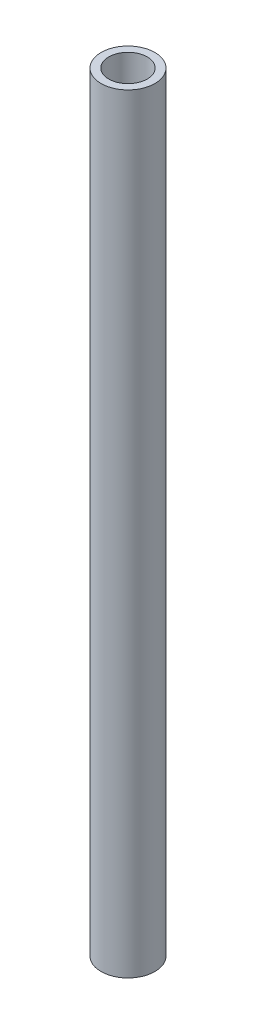
ISO-10303-21;
HEADER;
FILE_DESCRIPTION(('STEP AP214'),'2;1');
FILE_NAME('part.step','',(''),(''),'','','');
FILE_SCHEMA(('AUTOMOTIVE_DESIGN { 1 0 10303 214 1 1 1 1 }'));
ENDSEC;
DATA;
#1=APPLICATION_CONTEXT('core data for automotive mechanical design processes');
#2=APPLICATION_PROTOCOL_DEFINITION('international standard','automotive_design',2000,#1);
#3=PRODUCT_CONTEXT('',#1,'mechanical');
#4=PRODUCT('Part','Part','',(#3));
#5=PRODUCT_RELATED_PRODUCT_CATEGORY('part','',(#4));
#6=PRODUCT_DEFINITION_FORMATION('','',#4);
#7=PRODUCT_DEFINITION_CONTEXT('part definition',#1,'design');
#8=PRODUCT_DEFINITION('design','',#6,#7);
#9=PRODUCT_DEFINITION_SHAPE('','',#8);
#10=(LENGTH_UNIT() NAMED_UNIT(*) SI_UNIT(.MILLI.,.METRE.));
#11=(NAMED_UNIT(*) PLANE_ANGLE_UNIT() SI_UNIT($,.RADIAN.));
#12=(NAMED_UNIT(*) SI_UNIT($,.STERADIAN.) SOLID_ANGLE_UNIT());
#13=UNCERTAINTY_MEASURE_WITH_UNIT(LENGTH_MEASURE(1.E-05),#10,'distance_accuracy_value','');
#14=(GEOMETRIC_REPRESENTATION_CONTEXT(3) GLOBAL_UNCERTAINTY_ASSIGNED_CONTEXT((#13)) GLOBAL_UNIT_ASSIGNED_CONTEXT((#10,
#11,#12)) REPRESENTATION_CONTEXT('',''));
#15=CARTESIAN_POINT('',(0.,0.,0.));
#16=DIRECTION('',(0.,0.,1.));
#17=DIRECTION('',(1.,0.,0.));
#18=AXIS2_PLACEMENT_3D('',#15,#16,#17);
#19=CARTESIAN_POINT('',(0.,100.,0.));
#20=DIRECTION('',(0.,1.,0.));
#21=DIRECTION('',(0.,0.,1.));
#22=AXIS2_PLACEMENT_3D('',#19,#20,#21);
#23=PLANE('',#22);
#24=CARTESIAN_POINT('',(0.,100.,0.));
#25=DIRECTION('',(0.,1.,0.));
#26=DIRECTION('',(0.,0.,1.));
#27=AXIS2_PLACEMENT_3D('',#24,#25,#26);
#28=CIRCLE('',#27,3.5);
#29=CARTESIAN_POINT('',(0.,100.,3.5));
#30=VERTEX_POINT('',#29);
#31=EDGE_CURVE('E10',#30,#30,#28,.T.);
#32=ORIENTED_EDGE('',*,*,#31,.T.);
#33=EDGE_LOOP('',(#32));
#34=FACE_BOUND('',#33,.T.);
#35=CARTESIAN_POINT('',(0.,100.,0.));
#36=DIRECTION('',(0.,1.,0.));
#37=DIRECTION('',(0.,0.,1.));
#38=AXIS2_PLACEMENT_3D('',#35,#36,#37);
#39=CIRCLE('',#38,2.5);
#40=CARTESIAN_POINT('',(0.,100.,2.5));
#41=VERTEX_POINT('',#40);
#42=EDGE_CURVE('E54',#41,#41,#39,.T.);
#43=ORIENTED_EDGE('',*,*,#42,.F.);
#44=EDGE_LOOP('',(#43));
#45=FACE_BOUND('',#44,.T.);
#46=ADVANCED_FACE('F41',(#34,#45),#23,.T.);
#47=CARTESIAN_POINT('',(0.,0.,0.));
#48=DIRECTION('',(0.,1.,0.));
#49=DIRECTION('',(0.,0.,1.));
#50=AXIS2_PLACEMENT_3D('',#47,#48,#49);
#51=PLANE('',#50);
#52=CARTESIAN_POINT('',(0.,0.,0.));
#53=DIRECTION('',(0.,1.,0.));
#54=DIRECTION('',(0.,0.,1.));
#55=AXIS2_PLACEMENT_3D('',#52,#53,#54);
#56=CIRCLE('',#55,3.5);
#57=CARTESIAN_POINT('',(0.,0.,3.5));
#58=VERTEX_POINT('',#57);
#59=EDGE_CURVE('E45',#58,#58,#56,.T.);
#60=ORIENTED_EDGE('',*,*,#59,.F.);
#61=EDGE_LOOP('',(#60));
#62=FACE_BOUND('',#61,.T.);
#63=CARTESIAN_POINT('',(0.,0.,0.));
#64=DIRECTION('',(0.,1.,0.));
#65=DIRECTION('',(0.,0.,1.));
#66=AXIS2_PLACEMENT_3D('',#63,#64,#65);
#67=CIRCLE('',#66,2.5);
#68=CARTESIAN_POINT('',(0.,0.,2.5));
#69=VERTEX_POINT('',#68);
#70=EDGE_CURVE('E56',#69,#69,#67,.T.);
#71=ORIENTED_EDGE('',*,*,#70,.T.);
#72=EDGE_LOOP('',(#71));
#73=FACE_BOUND('',#72,.T.);
#74=ADVANCED_FACE('F68',(#62,#73),#51,.F.);
#75=CARTESIAN_POINT('',(0.,100.,0.));
#76=DIRECTION('',(0.,-1.,0.));
#77=DIRECTION('',(0.,0.,-1.));
#78=AXIS2_PLACEMENT_3D('',#75,#76,#77);
#79=CYLINDRICAL_SURFACE('',#78,3.5);
#80=ORIENTED_EDGE('',*,*,#31,.F.);
#81=EDGE_LOOP('',(#80));
#82=FACE_BOUND('',#81,.T.);
#83=ORIENTED_EDGE('',*,*,#59,.T.);
#84=EDGE_LOOP('',(#83));
#85=FACE_BOUND('',#84,.T.);
#86=ADVANCED_FACE('F43',(#82,#85),#79,.T.);
#87=CARTESIAN_POINT('',(0.,100.,0.));
#88=DIRECTION('',(0.,-1.,0.));
#89=DIRECTION('',(0.,0.,-1.));
#90=AXIS2_PLACEMENT_3D('',#87,#88,#89);
#91=CYLINDRICAL_SURFACE('',#90,2.5);
#92=ORIENTED_EDGE('',*,*,#42,.T.);
#93=EDGE_LOOP('',(#92));
#94=FACE_BOUND('',#93,.T.);
#95=ORIENTED_EDGE('',*,*,#70,.F.);
#96=EDGE_LOOP('',(#95));
#97=FACE_BOUND('',#96,.T.);
#98=ADVANCED_FACE('F64',(#94,#97),#91,.F.);
#99=CLOSED_SHELL('',(#46,#74,#86,#98));
#100=MANIFOLD_SOLID_BREP('B2',#99);
#101=ADVANCED_BREP_SHAPE_REPRESENTATION('',(#18,#100),#14);
#102=SHAPE_DEFINITION_REPRESENTATION(#9,#101);
ENDSEC;
END-ISO-10303-21;
